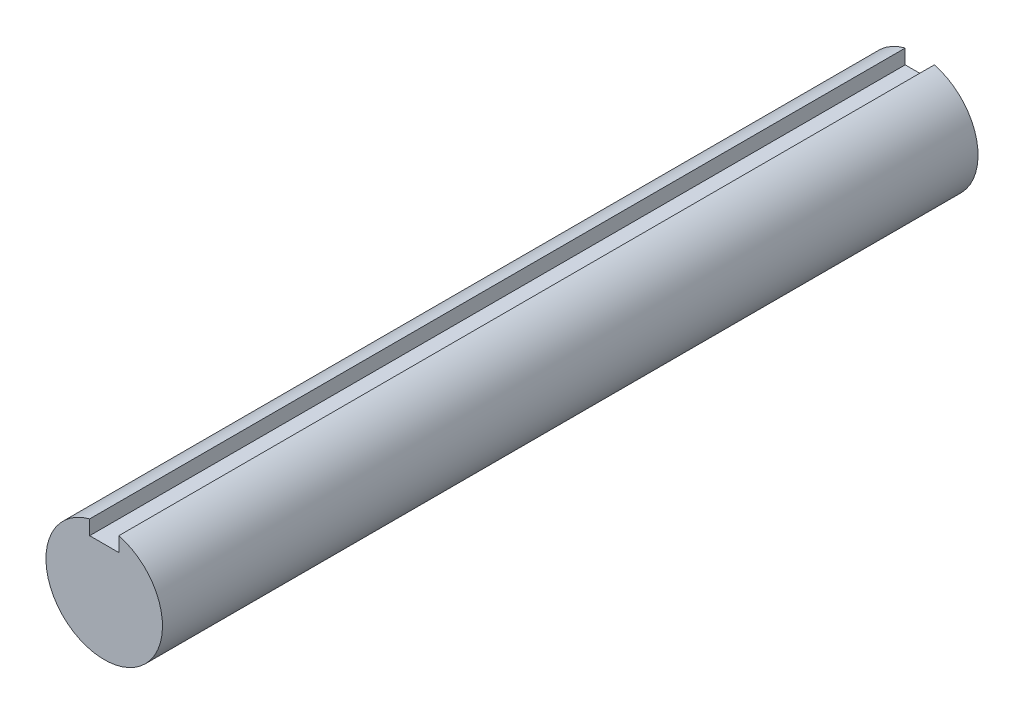
ISO-10303-21;
HEADER;
FILE_DESCRIPTION(('STEP AP214'),'2;1');
FILE_NAME('part.step','',(''),(''),'','','');
FILE_SCHEMA(('AUTOMOTIVE_DESIGN { 1 0 10303 214 1 1 1 1 }'));
ENDSEC;
DATA;
#1=APPLICATION_CONTEXT('core data for automotive mechanical design processes');
#2=APPLICATION_PROTOCOL_DEFINITION('international standard','automotive_design',2000,#1);
#3=PRODUCT_CONTEXT('',#1,'mechanical');
#4=PRODUCT('Part','Part','',(#3));
#5=PRODUCT_RELATED_PRODUCT_CATEGORY('part','',(#4));
#6=PRODUCT_DEFINITION_FORMATION('','',#4);
#7=PRODUCT_DEFINITION_CONTEXT('part definition',#1,'design');
#8=PRODUCT_DEFINITION('design','',#6,#7);
#9=PRODUCT_DEFINITION_SHAPE('','',#8);
#10=(LENGTH_UNIT() NAMED_UNIT(*) SI_UNIT(.MILLI.,.METRE.));
#11=(NAMED_UNIT(*) PLANE_ANGLE_UNIT() SI_UNIT($,.RADIAN.));
#12=(NAMED_UNIT(*) SI_UNIT($,.STERADIAN.) SOLID_ANGLE_UNIT());
#13=UNCERTAINTY_MEASURE_WITH_UNIT(LENGTH_MEASURE(1.E-05),#10,'distance_accuracy_value','');
#14=(GEOMETRIC_REPRESENTATION_CONTEXT(3) GLOBAL_UNCERTAINTY_ASSIGNED_CONTEXT((#13)) GLOBAL_UNIT_ASSIGNED_CONTEXT((#10,
#11,#12)) REPRESENTATION_CONTEXT('',''));
#15=CARTESIAN_POINT('',(0.,0.,0.));
#16=DIRECTION('',(0.,0.,1.));
#17=DIRECTION('',(1.,0.,0.));
#18=AXIS2_PLACEMENT_3D('',#15,#16,#17);
#19=CARTESIAN_POINT('',(0.,0.,66.675));
#20=DIRECTION('',(0.,0.,-1.));
#21=DIRECTION('',(-1.,0.,0.));
#22=AXIS2_PLACEMENT_3D('',#19,#20,#21);
#23=CYLINDRICAL_SURFACE('',#22,4.7625);
#24=CARTESIAN_POINT('',(0.,0.,0.));
#25=DIRECTION('',(0.,0.,1.));
#26=DIRECTION('',(1.,0.,0.));
#27=AXIS2_PLACEMENT_3D('',#24,#25,#26);
#28=CIRCLE('',#27,4.7625);
#29=CARTESIAN_POINT('',(-1.190625,4.6112707965782,0.));
#30=VERTEX_POINT('',#29);
#31=CARTESIAN_POINT('',(1.190625,4.61127079657821,0.));
#32=VERTEX_POINT('',#31);
#33=EDGE_CURVE('E95',#30,#32,#28,.T.);
#34=ORIENTED_EDGE('',*,*,#33,.T.);
#35=DIRECTION('',(0.,0.,-1.));
#36=VECTOR('',#35,1.);
#37=CARTESIAN_POINT('',(1.190625,4.61127079657821,66.675));
#38=LINE('',#37,#36);
#39=CARTESIAN_POINT('',(1.190625,4.61127079657821,66.675));
#40=VERTEX_POINT('',#39);
#41=EDGE_CURVE('E11',#40,#32,#38,.T.);
#42=ORIENTED_EDGE('',*,*,#41,.F.);
#43=CARTESIAN_POINT('',(0.,0.,66.675));
#44=DIRECTION('',(0.,0.,1.));
#45=DIRECTION('',(1.,0.,0.));
#46=AXIS2_PLACEMENT_3D('',#43,#44,#45);
#47=CIRCLE('',#46,4.7625);
#48=CARTESIAN_POINT('',(-1.190625,4.6112707965782,66.675));
#49=VERTEX_POINT('',#48);
#50=EDGE_CURVE('E83',#49,#40,#47,.T.);
#51=ORIENTED_EDGE('',*,*,#50,.F.);
#52=DIRECTION('',(0.,0.,-1.));
#53=VECTOR('',#52,1.);
#54=CARTESIAN_POINT('',(-1.190625,4.6112707965782,66.675));
#55=LINE('',#54,#53);
#56=EDGE_CURVE('E91',#49,#30,#55,.T.);
#57=ORIENTED_EDGE('',*,*,#56,.T.);
#58=EDGE_LOOP('',(#34,#42,#51,#57));
#59=FACE_BOUND('',#58,.T.);
#60=ADVANCED_FACE('F32',(#59),#23,.T.);
#61=CARTESIAN_POINT('',(1.190625,3.42064579657821,66.675));
#62=DIRECTION('',(1.,0.,0.));
#63=DIRECTION('',(0.,1.,0.));
#64=AXIS2_PLACEMENT_3D('',#61,#62,#63);
#65=PLANE('',#64);
#66=DIRECTION('',(0.,-1.,0.));
#67=VECTOR('',#66,1.);
#68=CARTESIAN_POINT('',(1.190625,3.42064579657821,0.));
#69=LINE('',#68,#67);
#70=CARTESIAN_POINT('',(1.190625,3.42064579657821,0.));
#71=VERTEX_POINT('',#70);
#72=EDGE_CURVE('E87',#32,#71,#69,.T.);
#73=ORIENTED_EDGE('',*,*,#72,.T.);
#74=DIRECTION('',(0.,0.,-1.));
#75=VECTOR('',#74,1.);
#76=CARTESIAN_POINT('',(1.190625,3.42064579657821,66.675));
#77=LINE('',#76,#75);
#78=CARTESIAN_POINT('',(1.190625,3.42064579657821,66.675));
#79=VERTEX_POINT('',#78);
#80=EDGE_CURVE('E40',#79,#71,#77,.T.);
#81=ORIENTED_EDGE('',*,*,#80,.F.);
#82=DIRECTION('',(0.,-1.,0.));
#83=VECTOR('',#82,1.);
#84=CARTESIAN_POINT('',(1.190625,3.42064579657821,66.675));
#85=LINE('',#84,#83);
#86=EDGE_CURVE('E78',#40,#79,#85,.T.);
#87=ORIENTED_EDGE('',*,*,#86,.F.);
#88=ORIENTED_EDGE('',*,*,#41,.T.);
#89=EDGE_LOOP('',(#73,#81,#87,#88));
#90=FACE_BOUND('',#89,.T.);
#91=ADVANCED_FACE('F86',(#90),#65,.F.);
#92=CARTESIAN_POINT('',(1.190625,3.42064579657821,66.675));
#93=DIRECTION('',(0.,-1.,0.));
#94=DIRECTION('',(1.,0.,0.));
#95=AXIS2_PLACEMENT_3D('',#92,#93,#94);
#96=PLANE('',#95);
#97=DIRECTION('',(-1.,0.,0.));
#98=VECTOR('',#97,1.);
#99=CARTESIAN_POINT('',(1.190625,3.42064579657821,0.));
#100=LINE('',#99,#98);
#101=CARTESIAN_POINT('',(-1.190625,3.42064579657821,0.));
#102=VERTEX_POINT('',#101);
#103=EDGE_CURVE('E65',#71,#102,#100,.T.);
#104=ORIENTED_EDGE('',*,*,#103,.T.);
#105=DIRECTION('',(0.,0.,-1.));
#106=VECTOR('',#105,1.);
#107=CARTESIAN_POINT('',(-1.190625,3.42064579657821,66.675));
#108=LINE('',#107,#106);
#109=CARTESIAN_POINT('',(-1.190625,3.42064579657821,66.675));
#110=VERTEX_POINT('',#109);
#111=EDGE_CURVE('E88',#110,#102,#108,.T.);
#112=ORIENTED_EDGE('',*,*,#111,.F.);
#113=DIRECTION('',(-1.,0.,0.));
#114=VECTOR('',#113,1.);
#115=CARTESIAN_POINT('',(1.190625,3.42064579657821,66.675));
#116=LINE('',#115,#114);
#117=EDGE_CURVE('E81',#79,#110,#116,.T.);
#118=ORIENTED_EDGE('',*,*,#117,.F.);
#119=ORIENTED_EDGE('',*,*,#80,.T.);
#120=EDGE_LOOP('',(#104,#112,#118,#119));
#121=FACE_BOUND('',#120,.T.);
#122=ADVANCED_FACE('F89',(#121),#96,.F.);
#123=CARTESIAN_POINT('',(-1.190625,3.42064579657821,66.675));
#124=DIRECTION('',(-1.,0.,0.));
#125=DIRECTION('',(0.,-1.,0.));
#126=AXIS2_PLACEMENT_3D('',#123,#124,#125);
#127=PLANE('',#126);
#128=DIRECTION('',(0.,1.,0.));
#129=VECTOR('',#128,1.);
#130=CARTESIAN_POINT('',(-1.190625,3.42064579657821,0.));
#131=LINE('',#130,#129);
#132=EDGE_CURVE('E71',#102,#30,#131,.T.);
#133=ORIENTED_EDGE('',*,*,#132,.T.);
#134=ORIENTED_EDGE('',*,*,#56,.F.);
#135=DIRECTION('',(0.,1.,0.));
#136=VECTOR('',#135,1.);
#137=CARTESIAN_POINT('',(-1.190625,3.42064579657821,66.675));
#138=LINE('',#137,#136);
#139=EDGE_CURVE('E48',#110,#49,#138,.T.);
#140=ORIENTED_EDGE('',*,*,#139,.F.);
#141=ORIENTED_EDGE('',*,*,#111,.T.);
#142=EDGE_LOOP('',(#133,#134,#140,#141));
#143=FACE_BOUND('',#142,.T.);
#144=ADVANCED_FACE('F102',(#143),#127,.F.);
#145=CARTESIAN_POINT('',(0.,0.,66.675));
#146=DIRECTION('',(0.,0.,1.));
#147=DIRECTION('',(1.,0.,0.));
#148=AXIS2_PLACEMENT_3D('',#145,#146,#147);
#149=PLANE('',#148);
#150=ORIENTED_EDGE('',*,*,#50,.T.);
#151=ORIENTED_EDGE('',*,*,#86,.T.);
#152=ORIENTED_EDGE('',*,*,#117,.T.);
#153=ORIENTED_EDGE('',*,*,#139,.T.);
#154=EDGE_LOOP('',(#150,#151,#152,#153));
#155=FACE_BOUND('',#154,.T.);
#156=ADVANCED_FACE('F79',(#155),#149,.T.);
#157=CARTESIAN_POINT('',(0.,0.,0.));
#158=DIRECTION('',(0.,0.,1.));
#159=DIRECTION('',(1.,0.,0.));
#160=AXIS2_PLACEMENT_3D('',#157,#158,#159);
#161=PLANE('',#160);
#162=ORIENTED_EDGE('',*,*,#33,.F.);
#163=ORIENTED_EDGE('',*,*,#132,.F.);
#164=ORIENTED_EDGE('',*,*,#103,.F.);
#165=ORIENTED_EDGE('',*,*,#72,.F.);
#166=EDGE_LOOP('',(#162,#163,#164,#165));
#167=FACE_BOUND('',#166,.T.);
#168=ADVANCED_FACE('F105',(#167),#161,.F.);
#169=CLOSED_SHELL('',(#60,#91,#122,#144,#156,#168));
#170=MANIFOLD_SOLID_BREP('B2',#169);
#171=ADVANCED_BREP_SHAPE_REPRESENTATION('',(#18,#170),#14);
#172=SHAPE_DEFINITION_REPRESENTATION(#9,#171);
ENDSEC;
END-ISO-10303-21;
